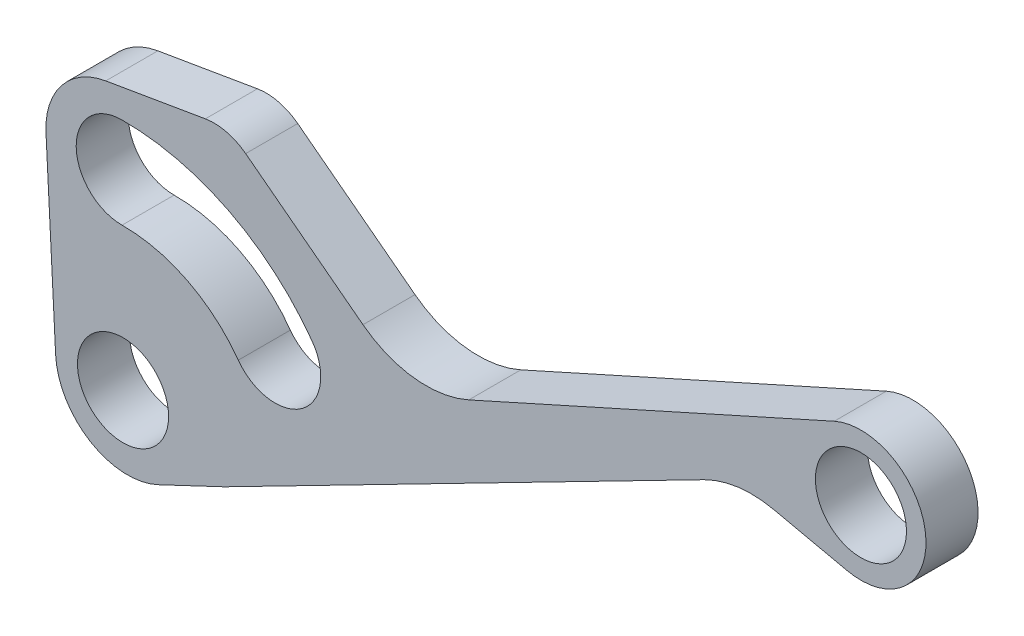
ISO-10303-21;
HEADER;
FILE_DESCRIPTION(('STEP AP214'),'2;1');
FILE_NAME('part.step','',(''),(''),'','','');
FILE_SCHEMA(('AUTOMOTIVE_DESIGN { 1 0 10303 214 1 1 1 1 }'));
ENDSEC;
DATA;
#1=APPLICATION_CONTEXT('core data for automotive mechanical design processes');
#2=APPLICATION_PROTOCOL_DEFINITION('international standard','automotive_design',2000,#1);
#3=PRODUCT_CONTEXT('',#1,'mechanical');
#4=PRODUCT('Part','Part','',(#3));
#5=PRODUCT_RELATED_PRODUCT_CATEGORY('part','',(#4));
#6=PRODUCT_DEFINITION_FORMATION('','',#4);
#7=PRODUCT_DEFINITION_CONTEXT('part definition',#1,'design');
#8=PRODUCT_DEFINITION('design','',#6,#7);
#9=PRODUCT_DEFINITION_SHAPE('','',#8);
#10=(LENGTH_UNIT() NAMED_UNIT(*) SI_UNIT(.MILLI.,.METRE.));
#11=(NAMED_UNIT(*) PLANE_ANGLE_UNIT() SI_UNIT($,.RADIAN.));
#12=(NAMED_UNIT(*) SI_UNIT($,.STERADIAN.) SOLID_ANGLE_UNIT());
#13=UNCERTAINTY_MEASURE_WITH_UNIT(LENGTH_MEASURE(1.E-05),#10,'distance_accuracy_value','');
#14=(GEOMETRIC_REPRESENTATION_CONTEXT(3) GLOBAL_UNCERTAINTY_ASSIGNED_CONTEXT((#13)) GLOBAL_UNIT_ASSIGNED_CONTEXT((#10,
#11,#12)) REPRESENTATION_CONTEXT('',''));
#15=CARTESIAN_POINT('',(0.,0.,0.));
#16=DIRECTION('',(0.,0.,1.));
#17=DIRECTION('',(1.,0.,0.));
#18=AXIS2_PLACEMENT_3D('',#15,#16,#17);
#19=CARTESIAN_POINT('',(-9.44238957739122,-5.34461766062594,3.));
#20=DIRECTION('',(0.,0.,-1.));
#21=DIRECTION('',(-1.,0.,0.));
#22=AXIS2_PLACEMENT_3D('',#19,#20,#21);
#23=CYLINDRICAL_SURFACE('',#22,17.94545354);
#24=CARTESIAN_POINT('',(-9.44238957739122,-5.34461766062594,-1.));
#25=DIRECTION('',(0.,0.,1.));
#26=DIRECTION('',(1.,0.,0.));
#27=AXIS2_PLACEMENT_3D('',#24,#25,#26);
#28=CIRCLE('',#27,17.94545354);
#29=CARTESIAN_POINT('',(5.08119986654892,5.19600150620527,-1.));
#30=VERTEX_POINT('',#29);
#31=CARTESIAN_POINT('',(-9.56661865396751,12.6004058805353,-1.));
#32=VERTEX_POINT('',#31);
#33=EDGE_CURVE('E231',#30,#32,#28,.T.);
#34=ORIENTED_EDGE('',*,*,#33,.F.);
#35=DIRECTION('',(0.,0.,-1.));
#36=VECTOR('',#35,1.);
#37=CARTESIAN_POINT('',(5.08119986654892,5.19600150620527,3.));
#38=LINE('',#37,#36);
#39=CARTESIAN_POINT('',(5.08119986654892,5.19600150620527,3.));
#40=VERTEX_POINT('',#39);
#41=EDGE_CURVE('E11',#40,#30,#38,.T.);
#42=ORIENTED_EDGE('',*,*,#41,.F.);
#43=CARTESIAN_POINT('',(-9.44238957739122,-5.34461766062594,3.));
#44=DIRECTION('',(0.,0.,1.));
#45=DIRECTION('',(1.,0.,0.));
#46=AXIS2_PLACEMENT_3D('',#43,#44,#45);
#47=CIRCLE('',#46,17.94545354);
#48=CARTESIAN_POINT('',(-9.56661865396751,12.6004058805353,3.));
#49=VERTEX_POINT('',#48);
#50=EDGE_CURVE('E182',#40,#49,#47,.T.);
#51=ORIENTED_EDGE('',*,*,#50,.T.);
#52=DIRECTION('',(0.,0.,-1.));
#53=VECTOR('',#52,1.);
#54=CARTESIAN_POINT('',(-9.56661865396751,12.6004058805353,3.));
#55=LINE('',#54,#53);
#56=EDGE_CURVE('E56',#49,#32,#55,.T.);
#57=ORIENTED_EDGE('',*,*,#56,.T.);
#58=EDGE_LOOP('',(#34,#42,#51,#57));
#59=FACE_BOUND('',#58,.T.);
#60=ADVANCED_FACE('F37',(#59),#23,.F.);
#61=CARTESIAN_POINT('',(2.24858474537152,3.14020687266884,3.));
#62=DIRECTION('',(0.,0.,-1.));
#63=DIRECTION('',(-1.,0.,0.));
#64=AXIS2_PLACEMENT_3D('',#61,#62,#63);
#65=CYLINDRICAL_SURFACE('',#64,3.5);
#66=CARTESIAN_POINT('',(2.24858474537152,3.14020687266884,-1.));
#67=DIRECTION('',(0.,0.,1.));
#68=DIRECTION('',(1.,0.,0.));
#69=AXIS2_PLACEMENT_3D('',#66,#67,#68);
#70=CIRCLE('',#69,3.5);
#71=CARTESIAN_POINT('',(-0.58403037580588,1.08441223913242,-1.));
#72=VERTEX_POINT('',#71);
#73=EDGE_CURVE('E169',#72,#30,#70,.T.);
#74=ORIENTED_EDGE('',*,*,#73,.F.);
#75=DIRECTION('',(0.,0.,-1.));
#76=VECTOR('',#75,1.);
#77=CARTESIAN_POINT('',(-0.58403037580588,1.08441223913242,3.));
#78=LINE('',#77,#76);
#79=CARTESIAN_POINT('',(-0.58403037580588,1.08441223913242,3.));
#80=VERTEX_POINT('',#79);
#81=EDGE_CURVE('E47',#80,#72,#78,.T.);
#82=ORIENTED_EDGE('',*,*,#81,.F.);
#83=CARTESIAN_POINT('',(2.24858474537152,3.14020687266884,3.));
#84=DIRECTION('',(0.,0.,1.));
#85=DIRECTION('',(1.,0.,0.));
#86=AXIS2_PLACEMENT_3D('',#83,#84,#85);
#87=CIRCLE('',#86,3.5);
#88=EDGE_CURVE('E167',#80,#40,#87,.T.);
#89=ORIENTED_EDGE('',*,*,#88,.T.);
#90=ORIENTED_EDGE('',*,*,#41,.T.);
#91=EDGE_LOOP('',(#74,#82,#89,#90));
#92=FACE_BOUND('',#91,.T.);
#93=ADVANCED_FACE('F165',(#92),#65,.F.);
#94=CARTESIAN_POINT('',(-9.44238957739122,-5.34461766062594,3.));
#95=DIRECTION('',(0.,0.,-1.));
#96=DIRECTION('',(-1.,0.,0.));
#97=AXIS2_PLACEMENT_3D('',#94,#95,#96);
#98=CYLINDRICAL_SURFACE('',#97,10.94545354);
#99=CARTESIAN_POINT('',(-9.44238957739122,-5.34461766062594,-1.));
#100=DIRECTION('',(0.,0.,1.));
#101=DIRECTION('',(1.,0.,0.));
#102=AXIS2_PLACEMENT_3D('',#99,#100,#101);
#103=CIRCLE('',#102,10.94545354);
#104=CARTESIAN_POINT('',(-9.51816050081492,5.6005736105882,-1.));
#105=VERTEX_POINT('',#104);
#106=EDGE_CURVE('E234',#72,#105,#103,.T.);
#107=ORIENTED_EDGE('',*,*,#106,.T.);
#108=DIRECTION('',(0.,0.,-1.));
#109=VECTOR('',#108,1.);
#110=CARTESIAN_POINT('',(-9.51816050081492,5.6005736105882,3.));
#111=LINE('',#110,#109);
#112=CARTESIAN_POINT('',(-9.51816050081492,5.6005736105882,3.));
#113=VERTEX_POINT('',#112);
#114=EDGE_CURVE('E109',#113,#105,#111,.T.);
#115=ORIENTED_EDGE('',*,*,#114,.F.);
#116=CARTESIAN_POINT('',(-9.44238957739122,-5.34461766062594,3.));
#117=DIRECTION('',(0.,0.,1.));
#118=DIRECTION('',(1.,0.,0.));
#119=AXIS2_PLACEMENT_3D('',#116,#117,#118);
#120=CIRCLE('',#119,10.94545354);
#121=EDGE_CURVE('E173',#80,#113,#120,.T.);
#122=ORIENTED_EDGE('',*,*,#121,.F.);
#123=ORIENTED_EDGE('',*,*,#81,.T.);
#124=EDGE_LOOP('',(#107,#115,#122,#123));
#125=FACE_BOUND('',#124,.T.);
#126=ADVANCED_FACE('F174',(#125),#98,.T.);
#127=CARTESIAN_POINT('',(-9.84155784762175,9.12740415848377,3.));
#128=DIRECTION('',(0.,0.,-1.));
#129=DIRECTION('',(-1.,0.,0.));
#130=AXIS2_PLACEMENT_3D('',#127,#128,#129);
#131=CYLINDRICAL_SURFACE('',#130,5.52748296771509);
#132=CARTESIAN_POINT('',(-9.84155784762175,9.12740415848377,-1.));
#133=DIRECTION('',(0.,0.,1.));
#134=DIRECTION('',(1.,0.,0.));
#135=AXIS2_PLACEMENT_3D('',#132,#133,#134);
#136=CIRCLE('',#135,5.52748296771509);
#137=CARTESIAN_POINT('',(-15.3617632021766,8.84385380682678,-1.));
#138=VERTEX_POINT('',#137);
#139=CARTESIAN_POINT('',(-10.7677890496235,14.5767310635996,-1.));
#140=VERTEX_POINT('',#139);
#141=EDGE_CURVE('E193',#138,#140,#136,.F.);
#142=ORIENTED_EDGE('',*,*,#141,.F.);
#143=DIRECTION('',(0.,0.,-1.));
#144=VECTOR('',#143,1.);
#145=CARTESIAN_POINT('',(-15.3617632021766,8.84385380682678,3.));
#146=LINE('',#145,#144);
#147=CARTESIAN_POINT('',(-15.3617632021766,8.84385380682678,3.));
#148=VERTEX_POINT('',#147);
#149=EDGE_CURVE('E41',#148,#138,#146,.T.);
#150=ORIENTED_EDGE('',*,*,#149,.F.);
#151=CARTESIAN_POINT('',(-9.84155784762175,9.12740415848377,3.));
#152=DIRECTION('',(0.,0.,1.));
#153=DIRECTION('',(1.,0.,0.));
#154=AXIS2_PLACEMENT_3D('',#151,#152,#153);
#155=CIRCLE('',#154,5.52748296771509);
#156=CARTESIAN_POINT('',(-10.7677890496235,14.5767310635996,3.));
#157=VERTEX_POINT('',#156);
#158=EDGE_CURVE('E242',#148,#157,#155,.F.);
#159=ORIENTED_EDGE('',*,*,#158,.T.);
#160=DIRECTION('',(0.,0.,-1.));
#161=VECTOR('',#160,1.);
#162=CARTESIAN_POINT('',(-10.7677890496235,14.5767310635996,3.));
#163=LINE('',#162,#161);
#164=EDGE_CURVE('E192',#157,#140,#163,.T.);
#165=ORIENTED_EDGE('',*,*,#164,.T.);
#166=EDGE_LOOP('',(#142,#150,#159,#165));
#167=FACE_BOUND('',#166,.T.);
#168=ADVANCED_FACE('F39',(#167),#131,.T.);
#169=CARTESIAN_POINT('',(-14.6193004512191,-5.61053438011167,3.));
#170=DIRECTION('',(0.998683376646697,0.051298276867274,0.));
#171=DIRECTION('',(-0.051298276867274,0.998683376646697,0.));
#172=AXIS2_PLACEMENT_3D('',#169,#170,#171);
#173=PLANE('',#172);
#174=DIRECTION('',(0.051298276867274,-0.998683376646697,0.));
#175=VECTOR('',#174,1.);
#176=CARTESIAN_POINT('',(-14.6193004512191,-5.61053438011167,-1.));
#177=LINE('',#176,#175);
#178=CARTESIAN_POINT('',(-14.6214113719825,-5.56943862398475,-1.));
#179=VERTEX_POINT('',#178);
#180=EDGE_CURVE('E196',#138,#179,#177,.T.);
#181=ORIENTED_EDGE('',*,*,#180,.T.);
#182=DIRECTION('',(0.,0.,-1.));
#183=VECTOR('',#182,1.);
#184=CARTESIAN_POINT('',(-14.6214113719825,-5.56943862398475,3.));
#185=LINE('',#184,#183);
#186=CARTESIAN_POINT('',(-14.6214113719825,-5.56943862398475,3.));
#187=VERTEX_POINT('',#186);
#188=EDGE_CURVE('E268',#187,#179,#185,.T.);
#189=ORIENTED_EDGE('',*,*,#188,.F.);
#190=DIRECTION('',(0.051298276867274,-0.998683376646697,0.));
#191=VECTOR('',#190,1.);
#192=CARTESIAN_POINT('',(-14.6193004512191,-5.61053438011167,3.));
#193=LINE('',#192,#191);
#194=EDGE_CURVE('E277',#148,#187,#193,.T.);
#195=ORIENTED_EDGE('',*,*,#194,.F.);
#196=ORIENTED_EDGE('',*,*,#149,.T.);
#197=EDGE_LOOP('',(#181,#189,#195,#196));
#198=FACE_BOUND('',#197,.T.);
#199=ADVANCED_FACE('F276',(#198),#173,.F.);
#200=CARTESIAN_POINT('',(-9.1012060174277,-5.28588827232776,3.));
#201=DIRECTION('',(0.,0.,-1.));
#202=DIRECTION('',(-1.,0.,0.));
#203=AXIS2_PLACEMENT_3D('',#200,#201,#202);
#204=CYLINDRICAL_SURFACE('',#203,5.5274829677151);
#205=CARTESIAN_POINT('',(-9.1012060174277,-5.28588827232776,-1.));
#206=DIRECTION('',(0.,0.,1.));
#207=DIRECTION('',(1.,0.,0.));
#208=AXIS2_PLACEMENT_3D('',#205,#206,#207);
#209=CIRCLE('',#208,5.5274829677151);
#210=CARTESIAN_POINT('',(-6.73911736209238,-10.2832480895429,-1.));
#211=VERTEX_POINT('',#210);
#212=EDGE_CURVE('E198',#179,#211,#209,.T.);
#213=ORIENTED_EDGE('',*,*,#212,.T.);
#214=DIRECTION('',(0.,0.,-1.));
#215=VECTOR('',#214,1.);
#216=CARTESIAN_POINT('',(-6.73911736209238,-10.2832480895429,3.));
#217=LINE('',#216,#215);
#218=CARTESIAN_POINT('',(-6.73911736209238,-10.2832480895429,3.));
#219=VERTEX_POINT('',#218);
#220=EDGE_CURVE('E266',#219,#211,#217,.T.);
#221=ORIENTED_EDGE('',*,*,#220,.F.);
#222=CARTESIAN_POINT('',(-9.1012060174277,-5.28588827232776,3.));
#223=DIRECTION('',(0.,0.,1.));
#224=DIRECTION('',(1.,0.,0.));
#225=AXIS2_PLACEMENT_3D('',#222,#223,#224);
#226=CIRCLE('',#225,5.5274829677151);
#227=EDGE_CURVE('E343',#187,#219,#226,.T.);
#228=ORIENTED_EDGE('',*,*,#227,.F.);
#229=ORIENTED_EDGE('',*,*,#188,.T.);
#230=EDGE_LOOP('',(#213,#221,#228,#229));
#231=FACE_BOUND('',#230,.T.);
#232=ADVANCED_FACE('F342',(#231),#204,.T.);
#233=CARTESIAN_POINT('',(-7.04068568160326,-10.4257895779247,3.));
#234=DIRECTION('',(-0.42733531141241,0.904093209586301,0.));
#235=DIRECTION('',(-0.904093209586301,-0.42733531141241,0.));
#236=AXIS2_PLACEMENT_3D('',#233,#234,#235);
#237=PLANE('',#236);
#238=DIRECTION('',(0.904093209586301,0.42733531141241,0.));
#239=VECTOR('',#238,1.);
#240=CARTESIAN_POINT('',(-7.04068568160326,-10.4257895779247,-1.));
#241=LINE('',#240,#239);
#242=CARTESIAN_POINT('',(-1.6541214213631,-7.87973670286109,-1.));
#243=VERTEX_POINT('',#242);
#244=EDGE_CURVE('E200',#211,#243,#241,.T.);
#245=ORIENTED_EDGE('',*,*,#244,.T.);
#246=DIRECTION('',(0.,0.,-1.));
#247=VECTOR('',#246,1.);
#248=CARTESIAN_POINT('',(-1.6541214213631,-7.87973670286109,3.));
#249=LINE('',#248,#247);
#250=CARTESIAN_POINT('',(-1.6541214213631,-7.87973670286109,3.));
#251=VERTEX_POINT('',#250);
#252=EDGE_CURVE('E264',#251,#243,#249,.T.);
#253=ORIENTED_EDGE('',*,*,#252,.F.);
#254=DIRECTION('',(0.904093209586301,0.42733531141241,0.));
#255=VECTOR('',#254,1.);
#256=CARTESIAN_POINT('',(-7.04068568160326,-10.4257895779247,3.));
#257=LINE('',#256,#255);
#258=EDGE_CURVE('E341',#219,#251,#257,.T.);
#259=ORIENTED_EDGE('',*,*,#258,.F.);
#260=ORIENTED_EDGE('',*,*,#220,.T.);
#261=EDGE_LOOP('',(#245,#253,#259,#260));
#262=FACE_BOUND('',#261,.T.);
#263=ADVANCED_FACE('F339',(#262),#237,.F.);
#264=CARTESIAN_POINT('',(-6.79102306499423,-10.514294060436,3.));
#265=DIRECTION('',(0.456350773027626,-0.889799961765052,0.));
#266=DIRECTION('',(0.889799961765052,0.456350773027626,0.));
#267=AXIS2_PLACEMENT_3D('',#264,#265,#266);
#268=PLANE('',#267);
#269=DIRECTION('',(-0.889799961765052,-0.456350773027626,0.));
#270=VECTOR('',#269,1.);
#271=CARTESIAN_POINT('',(-6.79102306499423,-10.514294060436,-1.));
#272=LINE('',#271,#270);
#273=CARTESIAN_POINT('',(35.1936195109273,11.0183255373489,-1.));
#274=VERTEX_POINT('',#273);
#275=EDGE_CURVE('E203',#274,#243,#272,.T.);
#276=ORIENTED_EDGE('',*,*,#275,.F.);
#277=DIRECTION('',(0.,0.,-1.));
#278=VECTOR('',#277,1.);
#279=CARTESIAN_POINT('',(35.1936195109273,11.0183255373489,3.));
#280=LINE('',#279,#278);
#281=CARTESIAN_POINT('',(35.1936195109273,11.0183255373489,3.));
#282=VERTEX_POINT('',#281);
#283=EDGE_CURVE('E262',#282,#274,#280,.T.);
#284=ORIENTED_EDGE('',*,*,#283,.F.);
#285=DIRECTION('',(-0.889799961765052,-0.456350773027626,0.));
#286=VECTOR('',#285,1.);
#287=CARTESIAN_POINT('',(-6.79102306499423,-10.514294060436,3.));
#288=LINE('',#287,#286);
#289=EDGE_CURVE('E336',#282,#251,#288,.T.);
#290=ORIENTED_EDGE('',*,*,#289,.T.);
#291=ORIENTED_EDGE('',*,*,#252,.T.);
#292=EDGE_LOOP('',(#276,#284,#290,#291));
#293=FACE_BOUND('',#292,.T.);
#294=ADVANCED_FACE('F334',(#293),#268,.T.);
#295=CARTESIAN_POINT('',(38.8444256951483,3.89992584322848,3.));
#296=DIRECTION('',(0.,0.,-1.));
#297=DIRECTION('',(-1.,0.,0.));
#298=AXIS2_PLACEMENT_3D('',#295,#296,#297);
#299=CYLINDRICAL_SURFACE('',#298,8.);
#300=CARTESIAN_POINT('',(38.8444256951483,3.89992584322848,-1.));
#301=DIRECTION('',(0.,0.,1.));
#302=DIRECTION('',(1.,0.,0.));
#303=AXIS2_PLACEMENT_3D('',#300,#301,#302);
#304=CIRCLE('',#303,8.);
#305=CARTESIAN_POINT('',(40.5693249219,11.7117580647724,-1.));
#306=VERTEX_POINT('',#305);
#307=EDGE_CURVE('E206',#306,#274,#304,.T.);
#308=ORIENTED_EDGE('',*,*,#307,.F.);
#309=DIRECTION('',(0.,0.,-1.));
#310=VECTOR('',#309,1.);
#311=CARTESIAN_POINT('',(40.5693249219,11.7117580647724,3.));
#312=LINE('',#311,#310);
#313=CARTESIAN_POINT('',(40.5693249219,11.7117580647724,3.));
#314=VERTEX_POINT('',#313);
#315=EDGE_CURVE('E260',#314,#306,#312,.T.);
#316=ORIENTED_EDGE('',*,*,#315,.F.);
#317=CARTESIAN_POINT('',(38.8444256951483,3.89992584322848,3.));
#318=DIRECTION('',(0.,0.,1.));
#319=DIRECTION('',(1.,0.,0.));
#320=AXIS2_PLACEMENT_3D('',#317,#318,#319);
#321=CIRCLE('',#320,8.);
#322=EDGE_CURVE('E330',#314,#282,#321,.T.);
#323=ORIENTED_EDGE('',*,*,#322,.T.);
#324=ORIENTED_EDGE('',*,*,#283,.T.);
#325=EDGE_LOOP('',(#308,#316,#323,#324));
#326=FACE_BOUND('',#325,.T.);
#327=ADVANCED_FACE('F327',(#326),#299,.F.);
#328=CARTESIAN_POINT('',(-3.52634333103531,21.448345067092,3.));
#329=DIRECTION('',(-0.215612403343958,-0.976479027692987,0.));
#330=DIRECTION('',(0.976479027692988,-0.215612403343958,0.));
#331=AXIS2_PLACEMENT_3D('',#328,#329,#330);
#332=PLANE('',#331);
#333=DIRECTION('',(-0.976479027692988,0.215612403343958,0.));
#334=VECTOR('',#333,1.);
#335=CARTESIAN_POINT('',(-3.52634333103531,21.448345067092,-1.));
#336=LINE('',#335,#334);
#337=CARTESIAN_POINT('',(46.179548405889,10.4729872009091,-1.));
#338=VERTEX_POINT('',#337);
#339=EDGE_CURVE('E209',#338,#306,#336,.T.);
#340=ORIENTED_EDGE('',*,*,#339,.F.);
#341=DIRECTION('',(0.,0.,-1.));
#342=VECTOR('',#341,1.);
#343=CARTESIAN_POINT('',(46.179548405889,10.4729872009091,3.));
#344=LINE('',#343,#342);
#345=CARTESIAN_POINT('',(46.179548405889,10.4729872009091,3.));
#346=VERTEX_POINT('',#345);
#347=EDGE_CURVE('E258',#346,#338,#344,.T.);
#348=ORIENTED_EDGE('',*,*,#347,.F.);
#349=DIRECTION('',(-0.976479027692988,0.215612403343958,0.));
#350=VECTOR('',#349,1.);
#351=CARTESIAN_POINT('',(-3.52634333103531,21.448345067092,3.));
#352=LINE('',#351,#350);
#353=EDGE_CURVE('E323',#346,#314,#352,.T.);
#354=ORIENTED_EDGE('',*,*,#353,.T.);
#355=ORIENTED_EDGE('',*,*,#315,.T.);
#356=EDGE_LOOP('',(#340,#348,#354,#355));
#357=FACE_BOUND('',#356,.T.);
#358=ADVANCED_FACE('F322',(#357),#332,.T.);
#359=CARTESIAN_POINT('',(47.2576104226088,15.3553823393741,3.));
#360=DIRECTION('',(0.,0.,-1.));
#361=DIRECTION('',(-1.,0.,0.));
#362=AXIS2_PLACEMENT_3D('',#359,#360,#361);
#363=CYLINDRICAL_SURFACE('',#362,5.);
#364=CARTESIAN_POINT('',(47.2576104226088,15.3553823393741,-1.));
#365=DIRECTION('',(0.,0.,1.));
#366=DIRECTION('',(1.,0.,0.));
#367=AXIS2_PLACEMENT_3D('',#364,#365,#366);
#368=CIRCLE('',#367,5.);
#369=CARTESIAN_POINT('',(45.2079632194271,19.9159685234616,-1.));
#370=VERTEX_POINT('',#369);
#371=EDGE_CURVE('E212',#338,#370,#368,.T.);
#372=ORIENTED_EDGE('',*,*,#371,.T.);
#373=DIRECTION('',(0.,0.,-1.));
#374=VECTOR('',#373,1.);
#375=CARTESIAN_POINT('',(45.2079632194271,19.9159685234616,3.));
#376=LINE('',#375,#374);
#377=CARTESIAN_POINT('',(45.2079632194271,19.9159685234616,3.));
#378=VERTEX_POINT('',#377);
#379=EDGE_CURVE('E256',#378,#370,#376,.T.);
#380=ORIENTED_EDGE('',*,*,#379,.F.);
#381=CARTESIAN_POINT('',(47.2576104226088,15.3553823393741,3.));
#382=DIRECTION('',(0.,0.,1.));
#383=DIRECTION('',(1.,0.,0.));
#384=AXIS2_PLACEMENT_3D('',#381,#382,#383);
#385=CIRCLE('',#384,5.);
#386=EDGE_CURVE('E318',#346,#378,#385,.T.);
#387=ORIENTED_EDGE('',*,*,#386,.F.);
#388=ORIENTED_EDGE('',*,*,#347,.T.);
#389=EDGE_LOOP('',(#372,#380,#387,#388));
#390=FACE_BOUND('',#389,.T.);
#391=ADVANCED_FACE('F317',(#390),#363,.T.);
#392=CARTESIAN_POINT('',(-9.70385385508477,-4.762844187303,3.));
#393=DIRECTION('',(-0.409929440636329,0.912117236817497,0.));
#394=DIRECTION('',(-0.912117236817497,-0.409929440636329,0.));
#395=AXIS2_PLACEMENT_3D('',#392,#393,#394);
#396=PLANE('',#395);
#397=DIRECTION('',(0.912117236817497,0.409929440636329,0.));
#398=VECTOR('',#397,1.);
#399=CARTESIAN_POINT('',(-9.70385385508477,-4.762844187303,-1.));
#400=LINE('',#399,#398);
#401=CARTESIAN_POINT('',(17.1277534694134,7.29598480740213,-1.));
#402=VERTEX_POINT('',#401);
#403=EDGE_CURVE('E215',#402,#370,#400,.T.);
#404=ORIENTED_EDGE('',*,*,#403,.F.);
#405=DIRECTION('',(0.,0.,-1.));
#406=VECTOR('',#405,1.);
#407=CARTESIAN_POINT('',(17.1277534694134,7.29598480740213,3.));
#408=LINE('',#407,#406);
#409=CARTESIAN_POINT('',(17.1277534694134,7.29598480740213,3.));
#410=VERTEX_POINT('',#409);
#411=EDGE_CURVE('E254',#410,#402,#408,.T.);
#412=ORIENTED_EDGE('',*,*,#411,.F.);
#413=DIRECTION('',(0.912117236817497,0.409929440636329,0.));
#414=VECTOR('',#413,1.);
#415=CARTESIAN_POINT('',(-9.70385385508477,-4.762844187303,3.));
#416=LINE('',#415,#414);
#417=EDGE_CURVE('E314',#410,#378,#416,.T.);
#418=ORIENTED_EDGE('',*,*,#417,.T.);
#419=ORIENTED_EDGE('',*,*,#379,.T.);
#420=EDGE_LOOP('',(#404,#412,#418,#419));
#421=FACE_BOUND('',#420,.T.);
#422=ADVANCED_FACE('F310',(#421),#396,.T.);
#423=CARTESIAN_POINT('',(13.8483179443227,14.5929227019421,3.));
#424=DIRECTION('',(0.,0.,-1.));
#425=DIRECTION('',(-1.,0.,0.));
#426=AXIS2_PLACEMENT_3D('',#423,#424,#425);
#427=CYLINDRICAL_SURFACE('',#426,8.);
#428=CARTESIAN_POINT('',(13.8483179443227,14.5929227019421,-1.));
#429=DIRECTION('',(0.,0.,1.));
#430=DIRECTION('',(1.,0.,0.));
#431=AXIS2_PLACEMENT_3D('',#428,#429,#430);
#432=CIRCLE('',#431,8.);
#433=CARTESIAN_POINT('',(8.99449208107332,8.23364801930325,-1.));
#434=VERTEX_POINT('',#433);
#435=EDGE_CURVE('E218',#434,#402,#432,.T.);
#436=ORIENTED_EDGE('',*,*,#435,.F.);
#437=DIRECTION('',(0.,0.,-1.));
#438=VECTOR('',#437,1.);
#439=CARTESIAN_POINT('',(8.99449208107332,8.23364801930325,3.));
#440=LINE('',#439,#438);
#441=CARTESIAN_POINT('',(8.99449208107332,8.23364801930325,3.));
#442=VERTEX_POINT('',#441);
#443=EDGE_CURVE('E252',#442,#434,#440,.T.);
#444=ORIENTED_EDGE('',*,*,#443,.F.);
#445=CARTESIAN_POINT('',(13.8483179443227,14.5929227019421,3.));
#446=DIRECTION('',(0.,0.,1.));
#447=DIRECTION('',(1.,0.,0.));
#448=AXIS2_PLACEMENT_3D('',#445,#446,#447);
#449=CIRCLE('',#448,8.);
#450=EDGE_CURVE('E305',#442,#410,#449,.T.);
#451=ORIENTED_EDGE('',*,*,#450,.T.);
#452=ORIENTED_EDGE('',*,*,#411,.T.);
#453=EDGE_LOOP('',(#436,#444,#451,#452));
#454=FACE_BOUND('',#453,.T.);
#455=ADVANCED_FACE('F304',(#454),#427,.F.);
#456=CARTESIAN_POINT('',(3.89329480517743,12.1272246466626,3.));
#457=DIRECTION('',(-0.60672823290617,-0.794909335329858,0.));
#458=DIRECTION('',(0.794909335329858,-0.60672823290617,0.));
#459=AXIS2_PLACEMENT_3D('',#456,#457,#458);
#460=PLANE('',#459);
#461=DIRECTION('',(-0.794909335329858,0.60672823290617,0.));
#462=VECTOR('',#461,1.);
#463=CARTESIAN_POINT('',(3.89329480517743,12.1272246466626,-1.));
#464=LINE('',#463,#462);
#465=CARTESIAN_POINT('',(-0.0191406562926998,15.1134583570922,-1.));
#466=VERTEX_POINT('',#465);
#467=EDGE_CURVE('E221',#434,#466,#464,.T.);
#468=ORIENTED_EDGE('',*,*,#467,.T.);
#469=DIRECTION('',(0.,0.,-1.));
#470=VECTOR('',#469,1.);
#471=CARTESIAN_POINT('',(-0.0191406562926998,15.1134583570922,3.));
#472=LINE('',#471,#470);
#473=CARTESIAN_POINT('',(-0.0191406562926998,15.1134583570922,3.));
#474=VERTEX_POINT('',#473);
#475=EDGE_CURVE('E249',#474,#466,#472,.T.);
#476=ORIENTED_EDGE('',*,*,#475,.F.);
#477=DIRECTION('',(-0.794909335329858,0.60672823290617,0.));
#478=VECTOR('',#477,1.);
#479=CARTESIAN_POINT('',(3.89329480517743,12.1272246466626,3.));
#480=LINE('',#479,#478);
#481=EDGE_CURVE('E300',#442,#474,#480,.T.);
#482=ORIENTED_EDGE('',*,*,#481,.F.);
#483=ORIENTED_EDGE('',*,*,#443,.T.);
#484=EDGE_LOOP('',(#468,#476,#482,#483));
#485=FACE_BOUND('',#484,.T.);
#486=ADVANCED_FACE('F299',(#485),#460,.F.);
#487=CARTESIAN_POINT('',(-2.44605358791738,11.9338210157727,3.));
#488=DIRECTION('',(0.,0.,-1.));
#489=DIRECTION('',(-1.,0.,0.));
#490=AXIS2_PLACEMENT_3D('',#487,#488,#489);
#491=CYLINDRICAL_SURFACE('',#490,4.);
#492=CARTESIAN_POINT('',(-2.44605358791738,11.9338210157727,-1.));
#493=DIRECTION('',(0.,0.,1.));
#494=DIRECTION('',(1.,0.,0.));
#495=AXIS2_PLACEMENT_3D('',#492,#493,#494);
#496=CIRCLE('',#495,4.);
#497=CARTESIAN_POINT('',(-3.1163269889657,15.8772628586109,-1.));
#498=VERTEX_POINT('',#497);
#499=EDGE_CURVE('E223',#466,#498,#496,.T.);
#500=ORIENTED_EDGE('',*,*,#499,.T.);
#501=DIRECTION('',(0.,0.,-1.));
#502=VECTOR('',#501,1.);
#503=CARTESIAN_POINT('',(-3.1163269889657,15.8772628586109,3.));
#504=LINE('',#503,#502);
#505=CARTESIAN_POINT('',(-3.1163269889657,15.8772628586109,3.));
#506=VERTEX_POINT('',#505);
#507=EDGE_CURVE('E246',#506,#498,#504,.T.);
#508=ORIENTED_EDGE('',*,*,#507,.F.);
#509=CARTESIAN_POINT('',(-2.44605358791738,11.9338210157727,3.));
#510=DIRECTION('',(0.,0.,1.));
#511=DIRECTION('',(1.,0.,0.));
#512=AXIS2_PLACEMENT_3D('',#509,#510,#511);
#513=CIRCLE('',#512,4.);
#514=EDGE_CURVE('E296',#474,#506,#513,.T.);
#515=ORIENTED_EDGE('',*,*,#514,.F.);
#516=ORIENTED_EDGE('',*,*,#475,.T.);
#517=EDGE_LOOP('',(#500,#508,#515,#516));
#518=FACE_BOUND('',#517,.T.);
#519=ADVANCED_FACE('F293',(#518),#491,.T.);
#520=CARTESIAN_POINT('',(-9.54238957739122,9.10048974556175,3.));
#521=DIRECTION('',(0.,0.,-1.));
#522=DIRECTION('',(-1.,0.,0.));
#523=AXIS2_PLACEMENT_3D('',#520,#521,#522);
#524=CYLINDRICAL_SURFACE('',#523,3.5);
#525=CARTESIAN_POINT('',(-9.54238957739122,9.10048974556175,-1.));
#526=DIRECTION('',(0.,0.,1.));
#527=DIRECTION('',(1.,0.,0.));
#528=AXIS2_PLACEMENT_3D('',#525,#526,#527);
#529=CIRCLE('',#528,3.5);
#530=EDGE_CURVE('E236',#32,#105,#529,.T.);
#531=ORIENTED_EDGE('',*,*,#530,.F.);
#532=ORIENTED_EDGE('',*,*,#56,.F.);
#533=CARTESIAN_POINT('',(-9.54238957739122,9.10048974556175,3.));
#534=DIRECTION('',(0.,0.,1.));
#535=DIRECTION('',(1.,0.,0.));
#536=AXIS2_PLACEMENT_3D('',#533,#534,#535);
#537=CIRCLE('',#536,3.5);
#538=EDGE_CURVE('E177',#49,#113,#537,.T.);
#539=ORIENTED_EDGE('',*,*,#538,.T.);
#540=ORIENTED_EDGE('',*,*,#114,.T.);
#541=EDGE_LOOP('',(#531,#532,#539,#540));
#542=FACE_BOUND('',#541,.T.);
#543=ADVANCED_FACE('F385',(#542),#524,.F.);
#544=CARTESIAN_POINT('',(47.2576104226088,15.3553823393741,3.));
#545=DIRECTION('',(0.,0.,-1.));
#546=DIRECTION('',(-1.,0.,0.));
#547=AXIS2_PLACEMENT_3D('',#544,#545,#546);
#548=CYLINDRICAL_SURFACE('',#547,3.5);
#549=CARTESIAN_POINT('',(47.2576104226088,15.3553823393741,3.));
#550=DIRECTION('',(0.,0.,1.));
#551=DIRECTION('',(1.,0.,0.));
#552=AXIS2_PLACEMENT_3D('',#549,#550,#551);
#553=CIRCLE('',#552,3.5);
#554=CARTESIAN_POINT('',(50.7576104226088,15.3553823393741,3.));
#555=VERTEX_POINT('',#554);
#556=EDGE_CURVE('E184',#555,#555,#553,.T.);
#557=ORIENTED_EDGE('',*,*,#556,.T.);
#558=EDGE_LOOP('',(#557));
#559=FACE_BOUND('',#558,.T.);
#560=CARTESIAN_POINT('',(47.2576104226088,15.3553823393741,-1.));
#561=DIRECTION('',(0.,0.,1.));
#562=DIRECTION('',(1.,0.,0.));
#563=AXIS2_PLACEMENT_3D('',#560,#561,#562);
#564=CIRCLE('',#563,3.5);
#565=CARTESIAN_POINT('',(50.7576104226088,15.3553823393741,-1.));
#566=VERTEX_POINT('',#565);
#567=EDGE_CURVE('E228',#566,#566,#564,.T.);
#568=ORIENTED_EDGE('',*,*,#567,.F.);
#569=EDGE_LOOP('',(#568));
#570=FACE_BOUND('',#569,.T.);
#571=ADVANCED_FACE('F362',(#559,#570),#548,.F.);
#572=CARTESIAN_POINT('',(-12.7705927774687,14.2363111665157,3.));
#573=DIRECTION('',(0.167568350262083,-0.985860460709549,0.));
#574=DIRECTION('',(0.985860460709549,0.167568350262083,0.));
#575=AXIS2_PLACEMENT_3D('',#572,#573,#574);
#576=PLANE('',#575);
#577=DIRECTION('',(-0.985860460709549,-0.167568350262083,0.));
#578=VECTOR('',#577,1.);
#579=CARTESIAN_POINT('',(-12.7705927774687,14.2363111665157,-1.));
#580=LINE('',#579,#578);
#581=EDGE_CURVE('E225',#498,#140,#580,.T.);
#582=ORIENTED_EDGE('',*,*,#581,.T.);
#583=ORIENTED_EDGE('',*,*,#164,.F.);
#584=DIRECTION('',(-0.985860460709549,-0.167568350262083,0.));
#585=VECTOR('',#584,1.);
#586=CARTESIAN_POINT('',(-12.7705927774687,14.2363111665157,3.));
#587=LINE('',#586,#585);
#588=EDGE_CURVE('E358',#506,#157,#587,.T.);
#589=ORIENTED_EDGE('',*,*,#588,.F.);
#590=ORIENTED_EDGE('',*,*,#507,.T.);
#591=EDGE_LOOP('',(#582,#583,#589,#590));
#592=FACE_BOUND('',#591,.T.);
#593=ADVANCED_FACE('F287',(#592),#576,.F.);
#594=CARTESIAN_POINT('',(-9.44238957739122,-5.34461766062594,3.));
#595=DIRECTION('',(0.,0.,-1.));
#596=DIRECTION('',(-1.,0.,0.));
#597=AXIS2_PLACEMENT_3D('',#594,#595,#596);
#598=CYLINDRICAL_SURFACE('',#597,3.5);
#599=CARTESIAN_POINT('',(-9.44238957739122,-5.34461766062594,3.));
#600=DIRECTION('',(0.,0.,1.));
#601=DIRECTION('',(1.,0.,0.));
#602=AXIS2_PLACEMENT_3D('',#599,#600,#601);
#603=CIRCLE('',#602,3.5);
#604=CARTESIAN_POINT('',(-5.94238957739122,-5.34461766062594,3.));
#605=VERTEX_POINT('',#604);
#606=EDGE_CURVE('E189',#605,#605,#603,.T.);
#607=ORIENTED_EDGE('',*,*,#606,.T.);
#608=EDGE_LOOP('',(#607));
#609=FACE_BOUND('',#608,.T.);
#610=CARTESIAN_POINT('',(-9.44238957739122,-5.34461766062594,-1.));
#611=DIRECTION('',(0.,0.,1.));
#612=DIRECTION('',(1.,0.,0.));
#613=AXIS2_PLACEMENT_3D('',#610,#611,#612);
#614=CIRCLE('',#613,3.5);
#615=CARTESIAN_POINT('',(-5.94238957739122,-5.34461766062594,-1.));
#616=VERTEX_POINT('',#615);
#617=EDGE_CURVE('E239',#616,#616,#614,.T.);
#618=ORIENTED_EDGE('',*,*,#617,.F.);
#619=EDGE_LOOP('',(#618));
#620=FACE_BOUND('',#619,.T.);
#621=ADVANCED_FACE('F366',(#609,#620),#598,.F.);
#622=CARTESIAN_POINT('',(-9.44238957739122,-5.34461766062594,3.));
#623=DIRECTION('',(0.,0.,1.));
#624=DIRECTION('',(1.,0.,0.));
#625=AXIS2_PLACEMENT_3D('',#622,#623,#624);
#626=PLANE('',#625);
#627=ORIENTED_EDGE('',*,*,#158,.F.);
#628=ORIENTED_EDGE('',*,*,#194,.T.);
#629=ORIENTED_EDGE('',*,*,#227,.T.);
#630=ORIENTED_EDGE('',*,*,#258,.T.);
#631=ORIENTED_EDGE('',*,*,#289,.F.);
#632=ORIENTED_EDGE('',*,*,#322,.F.);
#633=ORIENTED_EDGE('',*,*,#353,.F.);
#634=ORIENTED_EDGE('',*,*,#386,.T.);
#635=ORIENTED_EDGE('',*,*,#417,.F.);
#636=ORIENTED_EDGE('',*,*,#450,.F.);
#637=ORIENTED_EDGE('',*,*,#481,.T.);
#638=ORIENTED_EDGE('',*,*,#514,.T.);
#639=ORIENTED_EDGE('',*,*,#588,.T.);
#640=EDGE_LOOP('',(#627,#628,#629,#630,#631,#632,#633,#634,#635,#636,#637,#638,#639));
#641=FACE_BOUND('',#640,.T.);
#642=ORIENTED_EDGE('',*,*,#556,.F.);
#643=EDGE_LOOP('',(#642));
#644=FACE_BOUND('',#643,.T.);
#645=ORIENTED_EDGE('',*,*,#50,.F.);
#646=ORIENTED_EDGE('',*,*,#88,.F.);
#647=ORIENTED_EDGE('',*,*,#121,.T.);
#648=ORIENTED_EDGE('',*,*,#538,.F.);
#649=EDGE_LOOP('',(#645,#646,#647,#648));
#650=FACE_BOUND('',#649,.T.);
#651=ORIENTED_EDGE('',*,*,#606,.F.);
#652=EDGE_LOOP('',(#651));
#653=FACE_BOUND('',#652,.T.);
#654=ADVANCED_FACE('F180',(#641,#644,#650,#653),#626,.T.);
#655=CARTESIAN_POINT('',(-9.44238957739122,-5.34461766062594,-1.));
#656=DIRECTION('',(0.,0.,1.));
#657=DIRECTION('',(1.,0.,0.));
#658=AXIS2_PLACEMENT_3D('',#655,#656,#657);
#659=PLANE('',#658);
#660=ORIENTED_EDGE('',*,*,#141,.T.);
#661=ORIENTED_EDGE('',*,*,#581,.F.);
#662=ORIENTED_EDGE('',*,*,#499,.F.);
#663=ORIENTED_EDGE('',*,*,#467,.F.);
#664=ORIENTED_EDGE('',*,*,#435,.T.);
#665=ORIENTED_EDGE('',*,*,#403,.T.);
#666=ORIENTED_EDGE('',*,*,#371,.F.);
#667=ORIENTED_EDGE('',*,*,#339,.T.);
#668=ORIENTED_EDGE('',*,*,#307,.T.);
#669=ORIENTED_EDGE('',*,*,#275,.T.);
#670=ORIENTED_EDGE('',*,*,#244,.F.);
#671=ORIENTED_EDGE('',*,*,#212,.F.);
#672=ORIENTED_EDGE('',*,*,#180,.F.);
#673=EDGE_LOOP('',(#660,#661,#662,#663,#664,#665,#666,#667,#668,#669,#670,#671,#672));
#674=FACE_BOUND('',#673,.T.);
#675=ORIENTED_EDGE('',*,*,#567,.T.);
#676=EDGE_LOOP('',(#675));
#677=FACE_BOUND('',#676,.T.);
#678=ORIENTED_EDGE('',*,*,#33,.T.);
#679=ORIENTED_EDGE('',*,*,#530,.T.);
#680=ORIENTED_EDGE('',*,*,#106,.F.);
#681=ORIENTED_EDGE('',*,*,#73,.T.);
#682=EDGE_LOOP('',(#678,#679,#680,#681));
#683=FACE_BOUND('',#682,.T.);
#684=ORIENTED_EDGE('',*,*,#617,.T.);
#685=EDGE_LOOP('',(#684));
#686=FACE_BOUND('',#685,.T.);
#687=ADVANCED_FACE('F280',(#674,#677,#683,#686),#659,.F.);
#688=CLOSED_SHELL('',(#60,#93,#126,#168,#199,#232,#263,#294,#327,#358,#391,#422,#455,#486,#519,
#543,#571,#593,#621,#654,#687));
#689=MANIFOLD_SOLID_BREP('B2',#688);
#690=ADVANCED_BREP_SHAPE_REPRESENTATION('',(#18,#689),#14);
#691=SHAPE_DEFINITION_REPRESENTATION(#9,#690);
ENDSEC;
END-ISO-10303-21;
